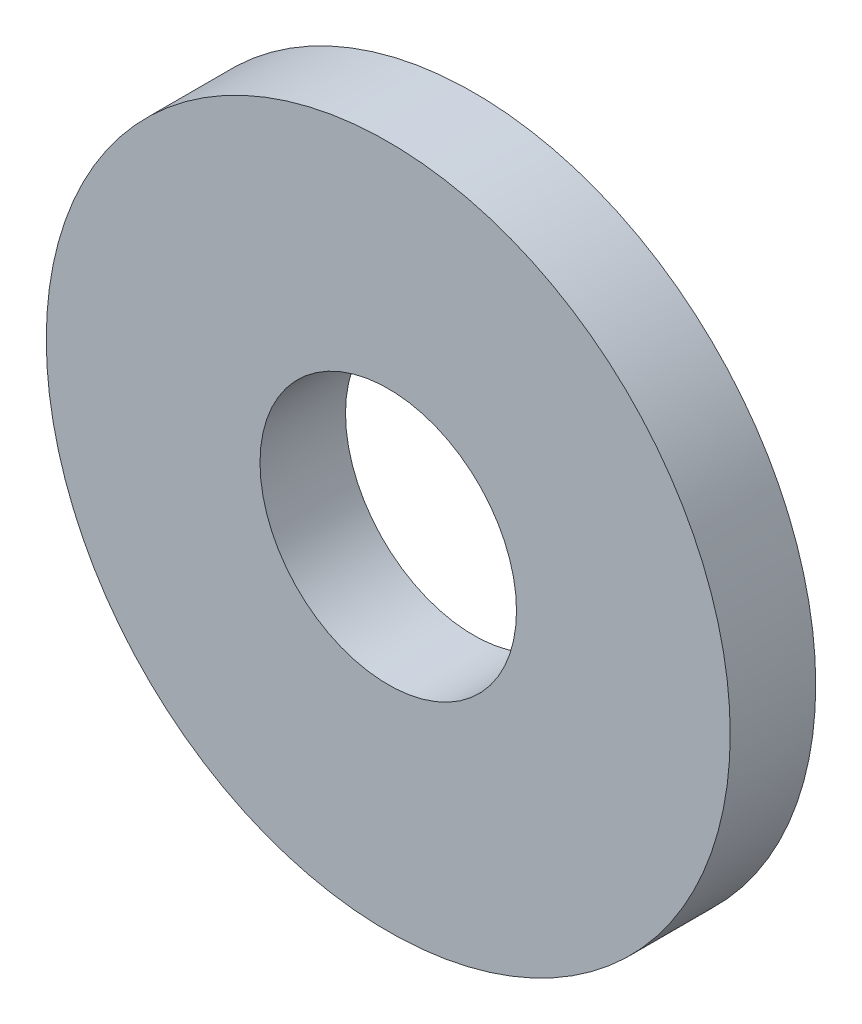
ISO-10303-21;
HEADER;
FILE_DESCRIPTION(('STEP AP214'),'2;1');
FILE_NAME('part.step','',(''),(''),'','','');
FILE_SCHEMA(('AUTOMOTIVE_DESIGN { 1 0 10303 214 1 1 1 1 }'));
ENDSEC;
DATA;
#1=APPLICATION_CONTEXT('core data for automotive mechanical design processes');
#2=APPLICATION_PROTOCOL_DEFINITION('international standard','automotive_design',2000,#1);
#3=PRODUCT_CONTEXT('',#1,'mechanical');
#4=PRODUCT('Part','Part','',(#3));
#5=PRODUCT_RELATED_PRODUCT_CATEGORY('part','',(#4));
#6=PRODUCT_DEFINITION_FORMATION('','',#4);
#7=PRODUCT_DEFINITION_CONTEXT('part definition',#1,'design');
#8=PRODUCT_DEFINITION('design','',#6,#7);
#9=PRODUCT_DEFINITION_SHAPE('','',#8);
#10=(LENGTH_UNIT() NAMED_UNIT(*) SI_UNIT(.MILLI.,.METRE.));
#11=(NAMED_UNIT(*) PLANE_ANGLE_UNIT() SI_UNIT($,.RADIAN.));
#12=(NAMED_UNIT(*) SI_UNIT($,.STERADIAN.) SOLID_ANGLE_UNIT());
#13=UNCERTAINTY_MEASURE_WITH_UNIT(LENGTH_MEASURE(1.E-05),#10,'distance_accuracy_value','');
#14=(GEOMETRIC_REPRESENTATION_CONTEXT(3) GLOBAL_UNCERTAINTY_ASSIGNED_CONTEXT((#13)) GLOBAL_UNIT_ASSIGNED_CONTEXT((#10,
#11,#12)) REPRESENTATION_CONTEXT('',''));
#15=CARTESIAN_POINT('',(0.,0.,0.));
#16=DIRECTION('',(0.,0.,1.));
#17=DIRECTION('',(1.,0.,0.));
#18=AXIS2_PLACEMENT_3D('',#15,#16,#17);
#19=CARTESIAN_POINT('',(0.,0.,5.));
#20=DIRECTION('',(0.,0.,1.));
#21=DIRECTION('',(1.,0.,0.));
#22=AXIS2_PLACEMENT_3D('',#19,#20,#21);
#23=PLANE('',#22);
#24=CARTESIAN_POINT('',(0.,0.,5.));
#25=DIRECTION('',(0.,0.,1.));
#26=DIRECTION('',(1.,0.,0.));
#27=AXIS2_PLACEMENT_3D('',#24,#25,#26);
#28=CIRCLE('',#27,20.);
#29=CARTESIAN_POINT('',(20.,0.,5.));
#30=VERTEX_POINT('',#29);
#31=EDGE_CURVE('E10',#30,#30,#28,.T.);
#32=ORIENTED_EDGE('',*,*,#31,.T.);
#33=EDGE_LOOP('',(#32));
#34=FACE_BOUND('',#33,.T.);
#35=CARTESIAN_POINT('',(0.,0.,5.));
#36=DIRECTION('',(0.,0.,1.));
#37=DIRECTION('',(1.,0.,0.));
#38=AXIS2_PLACEMENT_3D('',#35,#36,#37);
#39=CIRCLE('',#38,7.5);
#40=CARTESIAN_POINT('',(7.5,0.,5.));
#41=VERTEX_POINT('',#40);
#42=EDGE_CURVE('E48',#41,#41,#39,.T.);
#43=ORIENTED_EDGE('',*,*,#42,.F.);
#44=EDGE_LOOP('',(#43));
#45=FACE_BOUND('',#44,.T.);
#46=ADVANCED_FACE('F37',(#34,#45),#23,.T.);
#47=CARTESIAN_POINT('',(0.,0.,0.));
#48=DIRECTION('',(0.,0.,1.));
#49=DIRECTION('',(1.,0.,0.));
#50=AXIS2_PLACEMENT_3D('',#47,#48,#49);
#51=PLANE('',#50);
#52=CARTESIAN_POINT('',(0.,0.,0.));
#53=DIRECTION('',(0.,0.,1.));
#54=DIRECTION('',(1.,0.,0.));
#55=AXIS2_PLACEMENT_3D('',#52,#53,#54);
#56=CIRCLE('',#55,20.);
#57=CARTESIAN_POINT('',(20.,0.,0.));
#58=VERTEX_POINT('',#57);
#59=EDGE_CURVE('E41',#58,#58,#56,.T.);
#60=ORIENTED_EDGE('',*,*,#59,.F.);
#61=EDGE_LOOP('',(#60));
#62=FACE_BOUND('',#61,.T.);
#63=CARTESIAN_POINT('',(0.,0.,0.));
#64=DIRECTION('',(0.,0.,1.));
#65=DIRECTION('',(1.,0.,0.));
#66=AXIS2_PLACEMENT_3D('',#63,#64,#65);
#67=CIRCLE('',#66,7.5);
#68=CARTESIAN_POINT('',(7.5,0.,0.));
#69=VERTEX_POINT('',#68);
#70=EDGE_CURVE('E50',#69,#69,#67,.T.);
#71=ORIENTED_EDGE('',*,*,#70,.T.);
#72=EDGE_LOOP('',(#71));
#73=FACE_BOUND('',#72,.T.);
#74=ADVANCED_FACE('F60',(#62,#73),#51,.F.);
#75=CARTESIAN_POINT('',(0.,0.,5.));
#76=DIRECTION('',(0.,0.,-1.));
#77=DIRECTION('',(-1.,0.,0.));
#78=AXIS2_PLACEMENT_3D('',#75,#76,#77);
#79=CYLINDRICAL_SURFACE('',#78,20.);
#80=ORIENTED_EDGE('',*,*,#31,.F.);
#81=EDGE_LOOP('',(#80));
#82=FACE_BOUND('',#81,.T.);
#83=ORIENTED_EDGE('',*,*,#59,.T.);
#84=EDGE_LOOP('',(#83));
#85=FACE_BOUND('',#84,.T.);
#86=ADVANCED_FACE('F39',(#82,#85),#79,.T.);
#87=CARTESIAN_POINT('',(0.,0.,5.));
#88=DIRECTION('',(0.,0.,-1.));
#89=DIRECTION('',(-1.,0.,0.));
#90=AXIS2_PLACEMENT_3D('',#87,#88,#89);
#91=CYLINDRICAL_SURFACE('',#90,7.5);
#92=ORIENTED_EDGE('',*,*,#42,.T.);
#93=EDGE_LOOP('',(#92));
#94=FACE_BOUND('',#93,.T.);
#95=ORIENTED_EDGE('',*,*,#70,.F.);
#96=EDGE_LOOP('',(#95));
#97=FACE_BOUND('',#96,.T.);
#98=ADVANCED_FACE('F56',(#94,#97),#91,.F.);
#99=CLOSED_SHELL('',(#46,#74,#86,#98));
#100=MANIFOLD_SOLID_BREP('B2',#99);
#101=ADVANCED_BREP_SHAPE_REPRESENTATION('',(#18,#100),#14);
#102=SHAPE_DEFINITION_REPRESENTATION(#9,#101);
ENDSEC;
END-ISO-10303-21;
